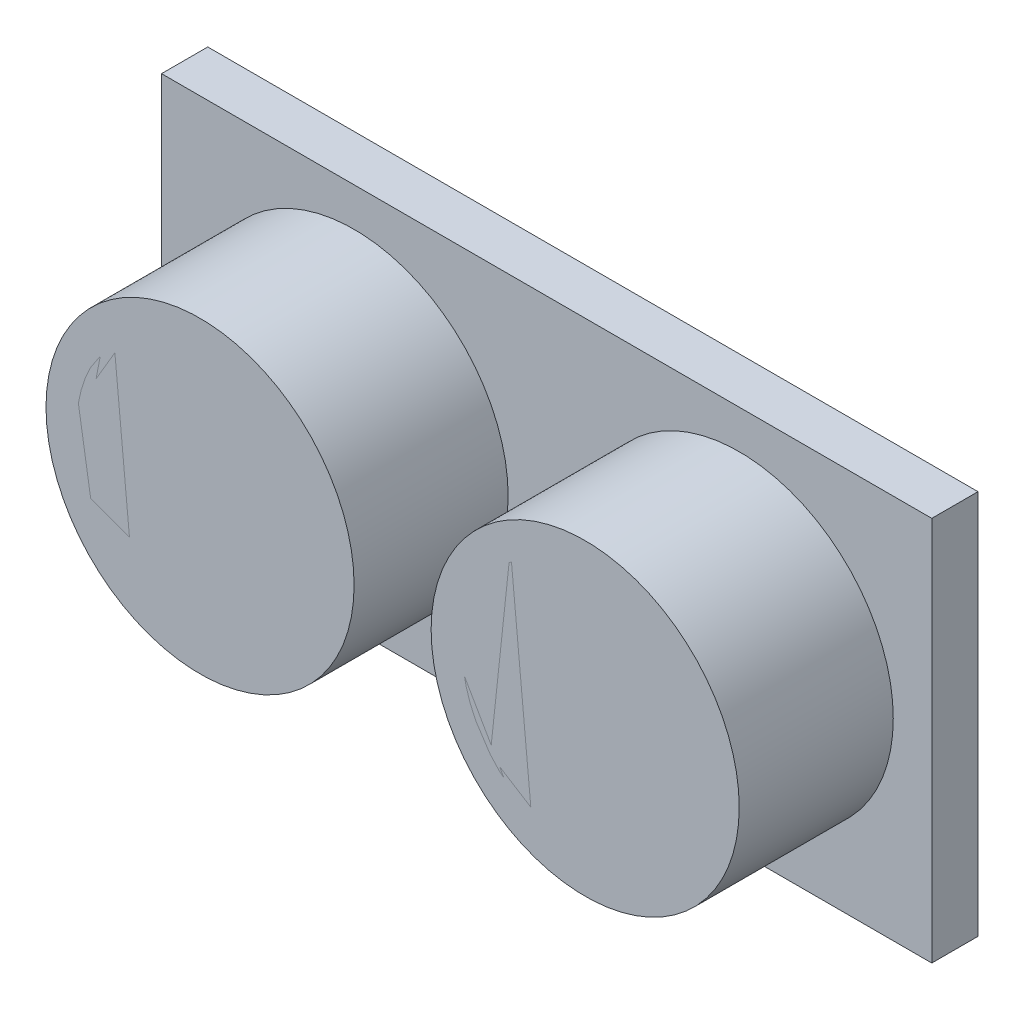
ISO-10303-21;
HEADER;
FILE_DESCRIPTION(('STEP AP214'),'2;1');
FILE_NAME('part.step','',(''),(''),'','','');
FILE_SCHEMA(('AUTOMOTIVE_DESIGN { 1 0 10303 214 1 1 1 1 }'));
ENDSEC;
DATA;
#1=APPLICATION_CONTEXT('core data for automotive mechanical design processes');
#2=APPLICATION_PROTOCOL_DEFINITION('international standard','automotive_design',2000,#1);
#3=PRODUCT_CONTEXT('',#1,'mechanical');
#4=PRODUCT('Part','Part','',(#3));
#5=PRODUCT_RELATED_PRODUCT_CATEGORY('part','',(#4));
#6=PRODUCT_DEFINITION_FORMATION('','',#4);
#7=PRODUCT_DEFINITION_CONTEXT('part definition',#1,'design');
#8=PRODUCT_DEFINITION('design','',#6,#7);
#9=PRODUCT_DEFINITION_SHAPE('','',#8);
#10=(LENGTH_UNIT() NAMED_UNIT(*) SI_UNIT(.MILLI.,.METRE.));
#11=(NAMED_UNIT(*) PLANE_ANGLE_UNIT() SI_UNIT($,.RADIAN.));
#12=(NAMED_UNIT(*) SI_UNIT($,.STERADIAN.) SOLID_ANGLE_UNIT());
#13=UNCERTAINTY_MEASURE_WITH_UNIT(LENGTH_MEASURE(1.E-05),#10,'distance_accuracy_value','');
#14=(GEOMETRIC_REPRESENTATION_CONTEXT(3) GLOBAL_UNCERTAINTY_ASSIGNED_CONTEXT((#13)) GLOBAL_UNIT_ASSIGNED_CONTEXT((#10,
#11,#12)) REPRESENTATION_CONTEXT('',''));
#15=CARTESIAN_POINT('',(0.,0.,0.));
#16=DIRECTION('',(0.,0.,1.));
#17=DIRECTION('',(1.,0.,0.));
#18=AXIS2_PLACEMENT_3D('',#15,#16,#17);
#19=CARTESIAN_POINT('',(37.5,12.5,8.));
#20=DIRECTION('',(0.,0.,1.));
#21=DIRECTION('',(1.,0.,0.));
#22=AXIS2_PLACEMENT_3D('',#19,#20,#21);
#23=CYLINDRICAL_SURFACE('',#22,8.);
#24=CARTESIAN_POINT('',(37.5,12.5,8.));
#25=DIRECTION('',(0.,0.,1.));
#26=DIRECTION('',(1.,0.,0.));
#27=AXIS2_PLACEMENT_3D('',#24,#25,#26);
#28=CIRCLE('',#27,8.);
#29=CARTESIAN_POINT('',(45.5,12.5,8.));
#30=VERTEX_POINT('',#29);
#31=EDGE_CURVE('E11',#30,#30,#28,.T.);
#32=ORIENTED_EDGE('',*,*,#31,.T.);
#33=EDGE_LOOP('',(#32));
#34=FACE_BOUND('',#33,.T.);
#35=CARTESIAN_POINT('',(37.5,12.5,13.));
#36=DIRECTION('',(0.,0.,1.));
#37=DIRECTION('',(1.,0.,0.));
#38=AXIS2_PLACEMENT_3D('',#35,#36,#37);
#39=CIRCLE('',#38,8.);
#40=CARTESIAN_POINT('',(45.5,12.5,13.));
#41=VERTEX_POINT('',#40);
#42=EDGE_CURVE('E47',#41,#41,#39,.T.);
#43=ORIENTED_EDGE('',*,*,#42,.F.);
#44=EDGE_LOOP('',(#43));
#45=FACE_BOUND('',#44,.T.);
#46=ADVANCED_FACE('F44',(#34,#45),#23,.T.);
#47=CARTESIAN_POINT('',(37.5,12.5,8.));
#48=DIRECTION('',(0.,0.,1.));
#49=DIRECTION('',(1.,0.,0.));
#50=AXIS2_PLACEMENT_3D('',#47,#48,#49);
#51=PLANE('',#50);
#52=ORIENTED_EDGE('',*,*,#31,.F.);
#53=EDGE_LOOP('',(#52));
#54=FACE_BOUND('',#53,.T.);
#55=ADVANCED_FACE('F59',(#54),#51,.F.);
#56=CARTESIAN_POINT('',(37.5,12.5,13.));
#57=DIRECTION('',(0.,0.,1.));
#58=DIRECTION('',(1.,0.,0.));
#59=AXIS2_PLACEMENT_3D('',#56,#57,#58);
#60=PLANE('',#59);
#61=ORIENTED_EDGE('',*,*,#42,.T.);
#62=EDGE_LOOP('',(#61));
#63=FACE_BOUND('',#62,.T.);
#64=ADVANCED_FACE('F56',(#63),#60,.T.);
#65=CLOSED_SHELL('',(#46,#55,#64));
#66=MANIFOLD_SOLID_BREP('B2',#65);
#67=CARTESIAN_POINT('',(12.5,12.5,8.));
#68=DIRECTION('',(0.,0.,1.));
#69=DIRECTION('',(1.,0.,0.));
#70=AXIS2_PLACEMENT_3D('',#67,#68,#69);
#71=CYLINDRICAL_SURFACE('',#70,8.);
#72=CARTESIAN_POINT('',(12.5,12.5,8.));
#73=DIRECTION('',(0.,0.,1.));
#74=DIRECTION('',(1.,0.,0.));
#75=AXIS2_PLACEMENT_3D('',#72,#73,#74);
#76=CIRCLE('',#75,8.);
#77=CARTESIAN_POINT('',(20.5,12.5,8.));
#78=VERTEX_POINT('',#77);
#79=EDGE_CURVE('E43',#78,#78,#76,.T.);
#80=ORIENTED_EDGE('',*,*,#79,.T.);
#81=EDGE_LOOP('',(#80));
#82=FACE_BOUND('',#81,.T.);
#83=CARTESIAN_POINT('',(12.5,12.5,13.));
#84=DIRECTION('',(0.,0.,1.));
#85=DIRECTION('',(1.,0.,0.));
#86=AXIS2_PLACEMENT_3D('',#83,#84,#85);
#87=CIRCLE('',#86,8.);
#88=CARTESIAN_POINT('',(20.5,12.5,13.));
#89=VERTEX_POINT('',#88);
#90=EDGE_CURVE('E99',#89,#89,#87,.T.);
#91=ORIENTED_EDGE('',*,*,#90,.F.);
#92=EDGE_LOOP('',(#91));
#93=FACE_BOUND('',#92,.T.);
#94=ADVANCED_FACE('F96',(#82,#93),#71,.T.);
#95=CARTESIAN_POINT('',(12.5,12.5,8.));
#96=DIRECTION('',(0.,0.,1.));
#97=DIRECTION('',(1.,0.,0.));
#98=AXIS2_PLACEMENT_3D('',#95,#96,#97);
#99=PLANE('',#98);
#100=ORIENTED_EDGE('',*,*,#79,.F.);
#101=EDGE_LOOP('',(#100));
#102=FACE_BOUND('',#101,.T.);
#103=ADVANCED_FACE('F111',(#102),#99,.F.);
#104=CARTESIAN_POINT('',(12.5,12.5,13.));
#105=DIRECTION('',(0.,0.,1.));
#106=DIRECTION('',(1.,0.,0.));
#107=AXIS2_PLACEMENT_3D('',#104,#105,#106);
#108=PLANE('',#107);
#109=ORIENTED_EDGE('',*,*,#90,.T.);
#110=EDGE_LOOP('',(#109));
#111=FACE_BOUND('',#110,.T.);
#112=ADVANCED_FACE('F108',(#111),#108,.T.);
#113=CLOSED_SHELL('',(#94,#103,#112));
#114=MANIFOLD_SOLID_BREP('B6',#113);
#115=CARTESIAN_POINT('',(0.,0.,3.));
#116=DIRECTION('',(1.,0.,0.));
#117=DIRECTION('',(0.,1.,0.));
#118=AXIS2_PLACEMENT_3D('',#115,#116,#117);
#119=PLANE('',#118);
#120=DIRECTION('',(0.,-1.,0.));
#121=VECTOR('',#120,1.);
#122=CARTESIAN_POINT('',(0.,0.,0.));
#123=LINE('',#122,#121);
#124=CARTESIAN_POINT('',(0.,25.,0.));
#125=VERTEX_POINT('',#124);
#126=CARTESIAN_POINT('',(0.,0.,0.));
#127=VERTEX_POINT('',#126);
#128=EDGE_CURVE('E206',#125,#127,#123,.T.);
#129=ORIENTED_EDGE('',*,*,#128,.T.);
#130=DIRECTION('',(0.,0.,-1.));
#131=VECTOR('',#130,1.);
#132=CARTESIAN_POINT('',(0.,0.,3.));
#133=LINE('',#132,#131);
#134=CARTESIAN_POINT('',(0.,0.,3.));
#135=VERTEX_POINT('',#134);
#136=EDGE_CURVE('E197',#135,#127,#133,.T.);
#137=ORIENTED_EDGE('',*,*,#136,.F.);
#138=DIRECTION('',(0.,-1.,0.));
#139=VECTOR('',#138,1.);
#140=CARTESIAN_POINT('',(0.,0.,3.));
#141=LINE('',#140,#139);
#142=CARTESIAN_POINT('',(0.,25.,3.));
#143=VERTEX_POINT('',#142);
#144=EDGE_CURVE('E191',#143,#135,#141,.T.);
#145=ORIENTED_EDGE('',*,*,#144,.F.);
#146=DIRECTION('',(0.,0.,-1.));
#147=VECTOR('',#146,1.);
#148=CARTESIAN_POINT('',(0.,25.,3.));
#149=LINE('',#148,#147);
#150=EDGE_CURVE('E202',#143,#125,#149,.T.);
#151=ORIENTED_EDGE('',*,*,#150,.T.);
#152=EDGE_LOOP('',(#129,#137,#145,#151));
#153=FACE_BOUND('',#152,.T.);
#154=ADVANCED_FACE('F139',(#153),#119,.F.);
#155=CARTESIAN_POINT('',(0.,0.,3.));
#156=DIRECTION('',(0.,1.,0.));
#157=DIRECTION('',(0.,0.,1.));
#158=AXIS2_PLACEMENT_3D('',#155,#156,#157);
#159=PLANE('',#158);
#160=DIRECTION('',(1.,0.,0.));
#161=VECTOR('',#160,1.);
#162=CARTESIAN_POINT('',(0.,0.,0.));
#163=LINE('',#162,#161);
#164=CARTESIAN_POINT('',(50.,0.,0.));
#165=VERTEX_POINT('',#164);
#166=EDGE_CURVE('E196',#127,#165,#163,.T.);
#167=ORIENTED_EDGE('',*,*,#166,.T.);
#168=DIRECTION('',(0.,0.,-1.));
#169=VECTOR('',#168,1.);
#170=CARTESIAN_POINT('',(50.,0.,3.));
#171=LINE('',#170,#169);
#172=CARTESIAN_POINT('',(50.,0.,3.));
#173=VERTEX_POINT('',#172);
#174=EDGE_CURVE('E194',#173,#165,#171,.T.);
#175=ORIENTED_EDGE('',*,*,#174,.F.);
#176=DIRECTION('',(1.,0.,0.));
#177=VECTOR('',#176,1.);
#178=CARTESIAN_POINT('',(0.,0.,3.));
#179=LINE('',#178,#177);
#180=EDGE_CURVE('E186',#135,#173,#179,.T.);
#181=ORIENTED_EDGE('',*,*,#180,.F.);
#182=ORIENTED_EDGE('',*,*,#136,.T.);
#183=EDGE_LOOP('',(#167,#175,#181,#182));
#184=FACE_BOUND('',#183,.T.);
#185=ADVANCED_FACE('F195',(#184),#159,.F.);
#186=CARTESIAN_POINT('',(50.,0.,3.));
#187=DIRECTION('',(-1.,0.,0.));
#188=DIRECTION('',(0.,-1.,0.));
#189=AXIS2_PLACEMENT_3D('',#186,#187,#188);
#190=PLANE('',#189);
#191=DIRECTION('',(0.,1.,0.));
#192=VECTOR('',#191,1.);
#193=CARTESIAN_POINT('',(50.,0.,0.));
#194=LINE('',#193,#192);
#195=CARTESIAN_POINT('',(50.,25.,0.));
#196=VERTEX_POINT('',#195);
#197=EDGE_CURVE('E172',#165,#196,#194,.T.);
#198=ORIENTED_EDGE('',*,*,#197,.T.);
#199=DIRECTION('',(0.,0.,-1.));
#200=VECTOR('',#199,1.);
#201=CARTESIAN_POINT('',(50.,25.,3.));
#202=LINE('',#201,#200);
#203=CARTESIAN_POINT('',(50.,25.,3.));
#204=VERTEX_POINT('',#203);
#205=EDGE_CURVE('E198',#204,#196,#202,.T.);
#206=ORIENTED_EDGE('',*,*,#205,.F.);
#207=DIRECTION('',(0.,1.,0.));
#208=VECTOR('',#207,1.);
#209=CARTESIAN_POINT('',(50.,0.,3.));
#210=LINE('',#209,#208);
#211=EDGE_CURVE('E189',#173,#204,#210,.T.);
#212=ORIENTED_EDGE('',*,*,#211,.F.);
#213=ORIENTED_EDGE('',*,*,#174,.T.);
#214=EDGE_LOOP('',(#198,#206,#212,#213));
#215=FACE_BOUND('',#214,.T.);
#216=ADVANCED_FACE('F200',(#215),#190,.F.);
#217=CARTESIAN_POINT('',(0.,25.,3.));
#218=DIRECTION('',(0.,-1.,0.));
#219=DIRECTION('',(0.,0.,-1.));
#220=AXIS2_PLACEMENT_3D('',#217,#218,#219);
#221=PLANE('',#220);
#222=DIRECTION('',(-1.,0.,0.));
#223=VECTOR('',#222,1.);
#224=CARTESIAN_POINT('',(0.,25.,0.));
#225=LINE('',#224,#223);
#226=EDGE_CURVE('E178',#196,#125,#225,.T.);
#227=ORIENTED_EDGE('',*,*,#226,.T.);
#228=ORIENTED_EDGE('',*,*,#150,.F.);
#229=DIRECTION('',(-1.,0.,0.));
#230=VECTOR('',#229,1.);
#231=CARTESIAN_POINT('',(0.,25.,3.));
#232=LINE('',#231,#230);
#233=EDGE_CURVE('E155',#204,#143,#232,.T.);
#234=ORIENTED_EDGE('',*,*,#233,.F.);
#235=ORIENTED_EDGE('',*,*,#205,.T.);
#236=EDGE_LOOP('',(#227,#228,#234,#235));
#237=FACE_BOUND('',#236,.T.);
#238=ADVANCED_FACE('F237',(#237),#221,.F.);
#239=CARTESIAN_POINT('',(0.,0.,3.));
#240=DIRECTION('',(0.,0.,-1.));
#241=DIRECTION('',(-1.,0.,0.));
#242=AXIS2_PLACEMENT_3D('',#239,#240,#241);
#243=PLANE('',#242);
#244=CARTESIAN_POINT('',(37.5,12.5,3.));
#245=DIRECTION('',(0.,0.,-1.));
#246=DIRECTION('',(-1.,0.,0.));
#247=AXIS2_PLACEMENT_3D('',#244,#245,#246);
#248=CIRCLE('',#247,10.);
#249=CARTESIAN_POINT('',(27.5,12.5,3.));
#250=VERTEX_POINT('',#249);
#251=EDGE_CURVE('E94',#250,#250,#248,.F.);
#252=ORIENTED_EDGE('',*,*,#251,.F.);
#253=EDGE_LOOP('',(#252));
#254=FACE_BOUND('',#253,.T.);
#255=CARTESIAN_POINT('',(12.5,12.5,3.));
#256=DIRECTION('',(0.,0.,1.));
#257=DIRECTION('',(1.,0.,0.));
#258=AXIS2_PLACEMENT_3D('',#255,#256,#257);
#259=CIRCLE('',#258,10.);
#260=CARTESIAN_POINT('',(22.5,12.5,3.));
#261=VERTEX_POINT('',#260);
#262=EDGE_CURVE('E147',#261,#261,#259,.T.);
#263=ORIENTED_EDGE('',*,*,#262,.F.);
#264=EDGE_LOOP('',(#263));
#265=FACE_BOUND('',#264,.T.);
#266=ORIENTED_EDGE('',*,*,#144,.T.);
#267=ORIENTED_EDGE('',*,*,#180,.T.);
#268=ORIENTED_EDGE('',*,*,#211,.T.);
#269=ORIENTED_EDGE('',*,*,#233,.T.);
#270=EDGE_LOOP('',(#266,#267,#268,#269));
#271=FACE_BOUND('',#270,.T.);
#272=ADVANCED_FACE('F187',(#254,#265,#271),#243,.F.);
#273=CARTESIAN_POINT('',(0.,0.,0.));
#274=DIRECTION('',(0.,0.,-1.));
#275=DIRECTION('',(-1.,0.,0.));
#276=AXIS2_PLACEMENT_3D('',#273,#274,#275);
#277=PLANE('',#276);
#278=ORIENTED_EDGE('',*,*,#128,.F.);
#279=ORIENTED_EDGE('',*,*,#226,.F.);
#280=ORIENTED_EDGE('',*,*,#197,.F.);
#281=ORIENTED_EDGE('',*,*,#166,.F.);
#282=EDGE_LOOP('',(#278,#279,#280,#281));
#283=FACE_BOUND('',#282,.T.);
#284=ADVANCED_FACE('F236',(#283),#277,.T.);
#285=CARTESIAN_POINT('',(12.5,12.5,13.));
#286=DIRECTION('',(0.,0.,-1.));
#287=DIRECTION('',(-1.,0.,0.));
#288=AXIS2_PLACEMENT_3D('',#285,#286,#287);
#289=CYLINDRICAL_SURFACE('',#288,10.);
#290=CARTESIAN_POINT('',(12.5,12.5,13.));
#291=DIRECTION('',(0.,0.,1.));
#292=DIRECTION('',(1.,0.,0.));
#293=AXIS2_PLACEMENT_3D('',#290,#291,#292);
#294=CIRCLE('',#293,10.);
#295=CARTESIAN_POINT('',(22.5,12.5,13.));
#296=VERTEX_POINT('',#295);
#297=EDGE_CURVE('E209',#296,#296,#294,.T.);
#298=ORIENTED_EDGE('',*,*,#297,.F.);
#299=EDGE_LOOP('',(#298));
#300=FACE_BOUND('',#299,.T.);
#301=ORIENTED_EDGE('',*,*,#262,.T.);
#302=EDGE_LOOP('',(#301));
#303=FACE_BOUND('',#302,.T.);
#304=ADVANCED_FACE('F243',(#300,#303),#289,.T.);
#305=CARTESIAN_POINT('',(12.5,12.5,13.));
#306=DIRECTION('',(0.,0.,1.));
#307=DIRECTION('',(1.,0.,0.));
#308=AXIS2_PLACEMENT_3D('',#305,#306,#307);
#309=PLANE('',#308);
#310=ORIENTED_EDGE('',*,*,#297,.T.);
#311=EDGE_LOOP('',(#310));
#312=FACE_BOUND('',#311,.T.);
#313=ADVANCED_FACE('F230',(#312),#309,.T.);
#314=CARTESIAN_POINT('',(37.5,12.5,13.));
#315=DIRECTION('',(0.,0.,-1.));
#316=DIRECTION('',(-1.,0.,0.));
#317=AXIS2_PLACEMENT_3D('',#314,#315,#316);
#318=CYLINDRICAL_SURFACE('',#317,10.);
#319=CARTESIAN_POINT('',(37.5,12.5,13.));
#320=DIRECTION('',(0.,0.,1.));
#321=DIRECTION('',(1.,0.,0.));
#322=AXIS2_PLACEMENT_3D('',#319,#320,#321);
#323=CIRCLE('',#322,10.);
#324=CARTESIAN_POINT('',(47.5,12.5,13.));
#325=VERTEX_POINT('',#324);
#326=EDGE_CURVE('E221',#325,#325,#323,.T.);
#327=ORIENTED_EDGE('',*,*,#326,.F.);
#328=EDGE_LOOP('',(#327));
#329=FACE_BOUND('',#328,.T.);
#330=ORIENTED_EDGE('',*,*,#251,.T.);
#331=EDGE_LOOP('',(#330));
#332=FACE_BOUND('',#331,.T.);
#333=ADVANCED_FACE('F227',(#329,#332),#318,.T.);
#334=CARTESIAN_POINT('',(37.5,12.5,13.));
#335=DIRECTION('',(0.,0.,1.));
#336=DIRECTION('',(1.,0.,0.));
#337=AXIS2_PLACEMENT_3D('',#334,#335,#336);
#338=PLANE('',#337);
#339=ORIENTED_EDGE('',*,*,#326,.T.);
#340=EDGE_LOOP('',(#339));
#341=FACE_BOUND('',#340,.T.);
#342=ADVANCED_FACE('F225',(#341),#338,.T.);
#343=CLOSED_SHELL('',(#154,#185,#216,#238,#272,#284,#304,#313,#333,#342));
#344=MANIFOLD_SOLID_BREP('B38',#343);
#345=ADVANCED_BREP_SHAPE_REPRESENTATION('',(#18,#66,#114,#344),#14);
#346=SHAPE_DEFINITION_REPRESENTATION(#9,#345);
ENDSEC;
END-ISO-10303-21;
